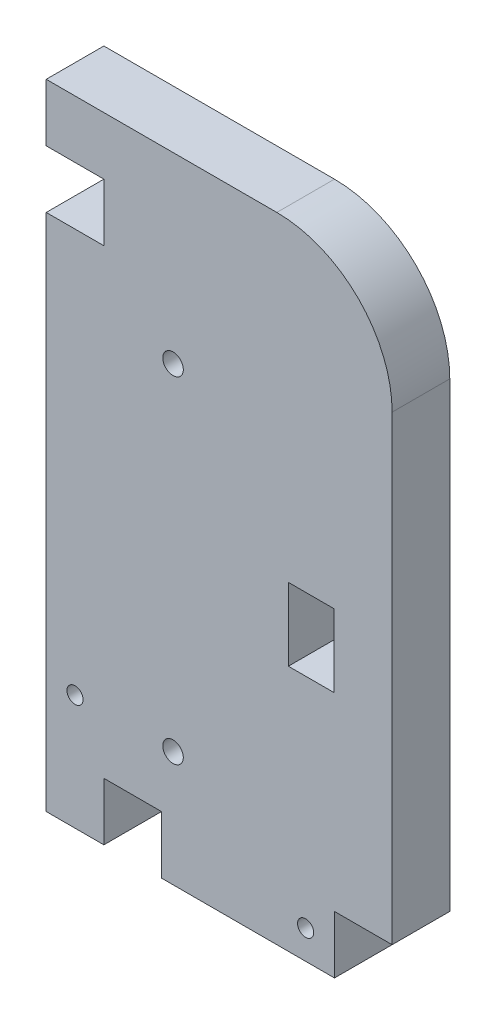
ISO-10303-21;
HEADER;
FILE_DESCRIPTION(('STEP AP214'),'2;1');
FILE_NAME('part.step','',(''),(''),'','','');
FILE_SCHEMA(('AUTOMOTIVE_DESIGN { 1 0 10303 214 1 1 1 1 }'));
ENDSEC;
DATA;
#1=APPLICATION_CONTEXT('core data for automotive mechanical design processes');
#2=APPLICATION_PROTOCOL_DEFINITION('international standard','automotive_design',2000,#1);
#3=PRODUCT_CONTEXT('',#1,'mechanical');
#4=PRODUCT('Part','Part','',(#3));
#5=PRODUCT_RELATED_PRODUCT_CATEGORY('part','',(#4));
#6=PRODUCT_DEFINITION_FORMATION('','',#4);
#7=PRODUCT_DEFINITION_CONTEXT('part definition',#1,'design');
#8=PRODUCT_DEFINITION('design','',#6,#7);
#9=PRODUCT_DEFINITION_SHAPE('','',#8);
#10=(LENGTH_UNIT() NAMED_UNIT(*) SI_UNIT(.MILLI.,.METRE.));
#11=(NAMED_UNIT(*) PLANE_ANGLE_UNIT() SI_UNIT($,.RADIAN.));
#12=(NAMED_UNIT(*) SI_UNIT($,.STERADIAN.) SOLID_ANGLE_UNIT());
#13=UNCERTAINTY_MEASURE_WITH_UNIT(LENGTH_MEASURE(1.E-05),#10,'distance_accuracy_value','');
#14=(GEOMETRIC_REPRESENTATION_CONTEXT(3) GLOBAL_UNCERTAINTY_ASSIGNED_CONTEXT((#13)) GLOBAL_UNIT_ASSIGNED_CONTEXT((#10,
#11,#12)) REPRESENTATION_CONTEXT('',''));
#15=CARTESIAN_POINT('',(0.,0.,0.));
#16=DIRECTION('',(0.,0.,1.));
#17=DIRECTION('',(1.,0.,0.));
#18=AXIS2_PLACEMENT_3D('',#15,#16,#17);
#19=CARTESIAN_POINT('',(9.26546463834282,9.31727084526302,6.35));
#20=DIRECTION('',(0.,0.,-1.));
#21=DIRECTION('',(-1.,0.,0.));
#22=AXIS2_PLACEMENT_3D('',#19,#20,#21);
#23=PLANE('',#22);
#24=CARTESIAN_POINT('',(12.4404646383428,-44.657729154737,6.35));
#25=DIRECTION('',(0.,0.,1.));
#26=DIRECTION('',(1.,0.,0.));
#27=AXIS2_PLACEMENT_3D('',#24,#25,#26);
#28=CIRCLE('',#27,0.888999999999999);
#29=CARTESIAN_POINT('',(13.3294646383428,-44.657729154737,6.35));
#30=VERTEX_POINT('',#29);
#31=EDGE_CURVE('E193',#30,#30,#28,.T.);
#32=ORIENTED_EDGE('',*,*,#31,.F.);
#33=EDGE_LOOP('',(#32));
#34=FACE_BOUND('',#33,.T.);
#35=CARTESIAN_POINT('',(-2.16453536165717,1.86727084526301,6.35));
#36=DIRECTION('',(0.,0.,1.));
#37=DIRECTION('',(1.,0.,0.));
#38=AXIS2_PLACEMENT_3D('',#35,#36,#37);
#39=CIRCLE('',#38,1.1303);
#40=CARTESIAN_POINT('',(-1.03423536165717,1.86727084526301,6.35));
#41=VERTEX_POINT('',#40);
#42=EDGE_CURVE('E203',#41,#41,#39,.T.);
#43=ORIENTED_EDGE('',*,*,#42,.F.);
#44=EDGE_LOOP('',(#43));
#45=FACE_BOUND('',#44,.T.);
#46=DIRECTION('',(0.,-1.,0.));
#47=VECTOR('',#46,1.);
#48=CARTESIAN_POINT('',(-16.1345353616572,22.017270845263,6.35));
#49=LINE('',#48,#47);
#50=CARTESIAN_POINT('',(-16.1345353616572,22.017270845263,6.35));
#51=VERTEX_POINT('',#50);
#52=CARTESIAN_POINT('',(-16.1345353616572,15.667270845263,6.35));
#53=VERTEX_POINT('',#52);
#54=EDGE_CURVE('E215',#51,#53,#49,.T.);
#55=ORIENTED_EDGE('',*,*,#54,.T.);
#56=DIRECTION('',(1.,0.,0.));
#57=VECTOR('',#56,1.);
#58=CARTESIAN_POINT('',(-16.1345353616572,15.667270845263,6.35));
#59=LINE('',#58,#57);
#60=CARTESIAN_POINT('',(-9.78453536165718,15.667270845263,6.35));
#61=VERTEX_POINT('',#60);
#62=EDGE_CURVE('E218',#53,#61,#59,.T.);
#63=ORIENTED_EDGE('',*,*,#62,.T.);
#64=DIRECTION('',(0.,-1.,0.));
#65=VECTOR('',#64,1.);
#66=CARTESIAN_POINT('',(-9.78453536165718,15.667270845263,6.35));
#67=LINE('',#66,#65);
#68=CARTESIAN_POINT('',(-9.78453536165718,9.31727084526301,6.35));
#69=VERTEX_POINT('',#68);
#70=EDGE_CURVE('E221',#61,#69,#67,.T.);
#71=ORIENTED_EDGE('',*,*,#70,.T.);
#72=DIRECTION('',(-1.,0.,0.));
#73=VECTOR('',#72,1.);
#74=CARTESIAN_POINT('',(-16.1345353616572,9.31727084526301,6.35));
#75=LINE('',#74,#73);
#76=CARTESIAN_POINT('',(-16.1345353616572,9.31727084526301,6.35));
#77=VERTEX_POINT('',#76);
#78=EDGE_CURVE('E223',#69,#77,#75,.T.);
#79=ORIENTED_EDGE('',*,*,#78,.T.);
#80=DIRECTION('',(0.,-1.,0.));
#81=VECTOR('',#80,1.);
#82=CARTESIAN_POINT('',(-16.1345353616572,9.31727084526301,6.35));
#83=LINE('',#82,#81);
#84=CARTESIAN_POINT('',(-16.1345353616572,-47.832729154737,6.35));
#85=VERTEX_POINT('',#84);
#86=EDGE_CURVE('E225',#77,#85,#83,.T.);
#87=ORIENTED_EDGE('',*,*,#86,.T.);
#88=DIRECTION('',(1.,0.,0.));
#89=VECTOR('',#88,1.);
#90=CARTESIAN_POINT('',(-16.1345353616572,-47.832729154737,6.35));
#91=LINE('',#90,#89);
#92=CARTESIAN_POINT('',(-9.78453536165718,-47.832729154737,6.35));
#93=VERTEX_POINT('',#92);
#94=EDGE_CURVE('E227',#85,#93,#91,.T.);
#95=ORIENTED_EDGE('',*,*,#94,.T.);
#96=DIRECTION('',(0.,1.,0.));
#97=VECTOR('',#96,1.);
#98=CARTESIAN_POINT('',(-9.78453536165718,-47.832729154737,6.35));
#99=LINE('',#98,#97);
#100=CARTESIAN_POINT('',(-9.78453536165719,-41.482729154737,6.35));
#101=VERTEX_POINT('',#100);
#102=EDGE_CURVE('E229',#93,#101,#99,.T.);
#103=ORIENTED_EDGE('',*,*,#102,.T.);
#104=DIRECTION('',(1.,0.,0.));
#105=VECTOR('',#104,1.);
#106=CARTESIAN_POINT('',(-9.78453536165719,-41.482729154737,6.35));
#107=LINE('',#106,#105);
#108=CARTESIAN_POINT('',(-3.43453536165719,-41.482729154737,6.35));
#109=VERTEX_POINT('',#108);
#110=EDGE_CURVE('E231',#101,#109,#107,.T.);
#111=ORIENTED_EDGE('',*,*,#110,.T.);
#112=DIRECTION('',(0.,-1.,0.));
#113=VECTOR('',#112,1.);
#114=CARTESIAN_POINT('',(-3.43453536165719,-47.832729154737,6.35));
#115=LINE('',#114,#113);
#116=CARTESIAN_POINT('',(-3.43453536165719,-47.832729154737,6.35));
#117=VERTEX_POINT('',#116);
#118=EDGE_CURVE('E233',#109,#117,#115,.T.);
#119=ORIENTED_EDGE('',*,*,#118,.T.);
#120=DIRECTION('',(1.,0.,0.));
#121=VECTOR('',#120,1.);
#122=CARTESIAN_POINT('',(-3.43453536165719,-47.832729154737,6.35));
#123=LINE('',#122,#121);
#124=CARTESIAN_POINT('',(15.6154646383428,-47.832729154737,6.35));
#125=VERTEX_POINT('',#124);
#126=EDGE_CURVE('E235',#117,#125,#123,.T.);
#127=ORIENTED_EDGE('',*,*,#126,.T.);
#128=DIRECTION('',(0.,1.,0.));
#129=VECTOR('',#128,1.);
#130=CARTESIAN_POINT('',(15.6154646383428,-47.832729154737,6.35));
#131=LINE('',#130,#129);
#132=CARTESIAN_POINT('',(15.6154646383428,-41.482729154737,6.35));
#133=VERTEX_POINT('',#132);
#134=EDGE_CURVE('E237',#125,#133,#131,.T.);
#135=ORIENTED_EDGE('',*,*,#134,.T.);
#136=DIRECTION('',(1.,0.,0.));
#137=VECTOR('',#136,1.);
#138=CARTESIAN_POINT('',(21.9654646383428,-41.482729154737,6.35));
#139=LINE('',#138,#137);
#140=CARTESIAN_POINT('',(21.9654646383428,-41.482729154737,6.35));
#141=VERTEX_POINT('',#140);
#142=EDGE_CURVE('E239',#133,#141,#139,.T.);
#143=ORIENTED_EDGE('',*,*,#142,.T.);
#144=DIRECTION('',(0.,1.,0.));
#145=VECTOR('',#144,1.);
#146=CARTESIAN_POINT('',(21.9654646383428,9.31727084526293,6.35));
#147=LINE('',#146,#145);
#148=CARTESIAN_POINT('',(21.9654646383428,9.31727084526294,6.35));
#149=VERTEX_POINT('',#148);
#150=EDGE_CURVE('E241',#141,#149,#147,.T.);
#151=ORIENTED_EDGE('',*,*,#150,.T.);
#152=CARTESIAN_POINT('',(9.26546463834282,9.31727084526302,6.35));
#153=DIRECTION('',(0.,0.,1.));
#154=DIRECTION('',(-1.,0.,0.));
#155=AXIS2_PLACEMENT_3D('',#152,#153,#154);
#156=CIRCLE('',#155,12.7);
#157=CARTESIAN_POINT('',(9.26546463834273,22.017270845263,6.35));
#158=VERTEX_POINT('',#157);
#159=EDGE_CURVE('E243',#149,#158,#156,.T.);
#160=ORIENTED_EDGE('',*,*,#159,.T.);
#161=DIRECTION('',(-1.,0.,0.));
#162=VECTOR('',#161,1.);
#163=CARTESIAN_POINT('',(-16.1345353616572,22.017270845263,6.35));
#164=LINE('',#163,#162);
#165=EDGE_CURVE('E245',#158,#51,#164,.T.);
#166=ORIENTED_EDGE('',*,*,#165,.T.);
#167=EDGE_LOOP('',(#55,#63,#71,#79,#87,#95,#103,#111,#119,#127,#135,#143,#151,#160,#166));
#168=FACE_BOUND('',#167,.T.);
#169=CARTESIAN_POINT('',(-2.16453536165716,-35.132729154737,6.35));
#170=DIRECTION('',(0.,0.,1.));
#171=DIRECTION('',(1.,0.,0.));
#172=AXIS2_PLACEMENT_3D('',#169,#170,#171);
#173=CIRCLE('',#172,1.1303);
#174=CARTESIAN_POINT('',(-1.03423536165716,-35.132729154737,6.35));
#175=VERTEX_POINT('',#174);
#176=EDGE_CURVE('E209',#175,#175,#173,.T.);
#177=ORIENTED_EDGE('',*,*,#176,.F.);
#178=EDGE_LOOP('',(#177));
#179=FACE_BOUND('',#178,.T.);
#180=DIRECTION('',(0.,-1.,0.));
#181=VECTOR('',#180,1.);
#182=CARTESIAN_POINT('',(10.5354646383428,-12.632729078737,6.35));
#183=LINE('',#182,#181);
#184=CARTESIAN_POINT('',(10.5354646383428,-12.632729078737,6.35));
#185=VERTEX_POINT('',#184);
#186=CARTESIAN_POINT('',(10.5354646383428,-20.632729080737,6.35));
#187=VERTEX_POINT('',#186);
#188=EDGE_CURVE('E164',#185,#187,#183,.T.);
#189=ORIENTED_EDGE('',*,*,#188,.F.);
#190=DIRECTION('',(-1.,0.,0.));
#191=VECTOR('',#190,1.);
#192=CARTESIAN_POINT('',(10.5354646383428,-12.632729078737,6.35));
#193=LINE('',#192,#191);
#194=CARTESIAN_POINT('',(15.5354646383428,-12.632729078737,6.35));
#195=VERTEX_POINT('',#194);
#196=EDGE_CURVE('E187',#195,#185,#193,.T.);
#197=ORIENTED_EDGE('',*,*,#196,.F.);
#198=DIRECTION('',(0.,1.,0.));
#199=VECTOR('',#198,1.);
#200=CARTESIAN_POINT('',(15.5354646383428,-12.632729078737,6.35));
#201=LINE('',#200,#199);
#202=CARTESIAN_POINT('',(15.5354646383428,-20.632729080737,6.35));
#203=VERTEX_POINT('',#202);
#204=EDGE_CURVE('E185',#203,#195,#201,.T.);
#205=ORIENTED_EDGE('',*,*,#204,.F.);
#206=DIRECTION('',(1.,0.,0.));
#207=VECTOR('',#206,1.);
#208=CARTESIAN_POINT('',(10.5354646383428,-20.632729080737,6.35));
#209=LINE('',#208,#207);
#210=EDGE_CURVE('E172',#187,#203,#209,.T.);
#211=ORIENTED_EDGE('',*,*,#210,.F.);
#212=EDGE_LOOP('',(#189,#197,#205,#211));
#213=FACE_BOUND('',#212,.T.);
#214=CARTESIAN_POINT('',(-12.9595353616572,-35.132729154737,6.35));
#215=DIRECTION('',(0.,0.,1.));
#216=DIRECTION('',(1.,0.,0.));
#217=AXIS2_PLACEMENT_3D('',#214,#215,#216);
#218=CIRCLE('',#217,0.888999999999999);
#219=CARTESIAN_POINT('',(-12.0705353616572,-35.132729154737,6.35));
#220=VERTEX_POINT('',#219);
#221=EDGE_CURVE('E608',#220,#220,#218,.T.);
#222=ORIENTED_EDGE('',*,*,#221,.F.);
#223=EDGE_LOOP('',(#222));
#224=FACE_BOUND('',#223,.T.);
#225=ADVANCED_FACE('F33',(#34,#45,#168,#179,#213,#224),#23,.F.);
#226=CARTESIAN_POINT('',(9.26546463834282,9.31727084526302,0.));
#227=DIRECTION('',(0.,0.,-1.));
#228=DIRECTION('',(-1.,0.,0.));
#229=AXIS2_PLACEMENT_3D('',#226,#227,#228);
#230=PLANE('',#229);
#231=CARTESIAN_POINT('',(12.4404646383428,-44.657729154737,0.));
#232=DIRECTION('',(0.,0.,1.));
#233=DIRECTION('',(1.,0.,0.));
#234=AXIS2_PLACEMENT_3D('',#231,#232,#233);
#235=CIRCLE('',#234,0.888999999999999);
#236=CARTESIAN_POINT('',(13.3294646383428,-44.657729154737,0.));
#237=VERTEX_POINT('',#236);
#238=EDGE_CURVE('E614',#237,#237,#235,.T.);
#239=ORIENTED_EDGE('',*,*,#238,.T.);
#240=EDGE_LOOP('',(#239));
#241=FACE_BOUND('',#240,.T.);
#242=CARTESIAN_POINT('',(-2.16453536165717,1.86727084526301,0.));
#243=DIRECTION('',(0.,0.,1.));
#244=DIRECTION('',(1.,0.,0.));
#245=AXIS2_PLACEMENT_3D('',#242,#243,#244);
#246=CIRCLE('',#245,1.1303);
#247=CARTESIAN_POINT('',(-1.03423536165717,1.86727084526301,0.));
#248=VERTEX_POINT('',#247);
#249=EDGE_CURVE('E180',#248,#248,#246,.T.);
#250=ORIENTED_EDGE('',*,*,#249,.T.);
#251=EDGE_LOOP('',(#250));
#252=FACE_BOUND('',#251,.T.);
#253=DIRECTION('',(0.,-1.,0.));
#254=VECTOR('',#253,1.);
#255=CARTESIAN_POINT('',(-16.1345353616572,22.017270845263,0.));
#256=LINE('',#255,#254);
#257=CARTESIAN_POINT('',(-16.1345353616572,22.017270845263,0.));
#258=VERTEX_POINT('',#257);
#259=CARTESIAN_POINT('',(-16.1345353616572,15.667270845263,0.));
#260=VERTEX_POINT('',#259);
#261=EDGE_CURVE('E212',#258,#260,#256,.T.);
#262=ORIENTED_EDGE('',*,*,#261,.F.);
#263=DIRECTION('',(-1.,0.,0.));
#264=VECTOR('',#263,1.);
#265=CARTESIAN_POINT('',(-16.1345353616572,22.017270845263,0.));
#266=LINE('',#265,#264);
#267=CARTESIAN_POINT('',(9.26546463834273,22.017270845263,0.));
#268=VERTEX_POINT('',#267);
#269=EDGE_CURVE('E219',#268,#258,#266,.T.);
#270=ORIENTED_EDGE('',*,*,#269,.F.);
#271=CARTESIAN_POINT('',(9.26546463834282,9.31727084526302,0.));
#272=DIRECTION('',(0.,0.,1.));
#273=DIRECTION('',(-1.,0.,0.));
#274=AXIS2_PLACEMENT_3D('',#271,#272,#273);
#275=CIRCLE('',#274,12.7);
#276=CARTESIAN_POINT('',(21.9654646383428,9.31727084526294,0.));
#277=VERTEX_POINT('',#276);
#278=EDGE_CURVE('E274',#277,#268,#275,.T.);
#279=ORIENTED_EDGE('',*,*,#278,.F.);
#280=DIRECTION('',(0.,1.,0.));
#281=VECTOR('',#280,1.);
#282=CARTESIAN_POINT('',(21.9654646383428,9.31727084526293,0.));
#283=LINE('',#282,#281);
#284=CARTESIAN_POINT('',(21.9654646383428,-41.482729154737,0.));
#285=VERTEX_POINT('',#284);
#286=EDGE_CURVE('E272',#285,#277,#283,.T.);
#287=ORIENTED_EDGE('',*,*,#286,.F.);
#288=DIRECTION('',(1.,0.,0.));
#289=VECTOR('',#288,1.);
#290=CARTESIAN_POINT('',(21.9654646383428,-41.482729154737,0.));
#291=LINE('',#290,#289);
#292=CARTESIAN_POINT('',(15.6154646383428,-41.482729154737,0.));
#293=VERTEX_POINT('',#292);
#294=EDGE_CURVE('E270',#293,#285,#291,.T.);
#295=ORIENTED_EDGE('',*,*,#294,.F.);
#296=DIRECTION('',(0.,1.,0.));
#297=VECTOR('',#296,1.);
#298=CARTESIAN_POINT('',(15.6154646383428,-47.832729154737,0.));
#299=LINE('',#298,#297);
#300=CARTESIAN_POINT('',(15.6154646383428,-47.832729154737,0.));
#301=VERTEX_POINT('',#300);
#302=EDGE_CURVE('E268',#301,#293,#299,.T.);
#303=ORIENTED_EDGE('',*,*,#302,.F.);
#304=DIRECTION('',(1.,0.,0.));
#305=VECTOR('',#304,1.);
#306=CARTESIAN_POINT('',(-3.43453536165719,-47.832729154737,0.));
#307=LINE('',#306,#305);
#308=CARTESIAN_POINT('',(-3.43453536165719,-47.832729154737,0.));
#309=VERTEX_POINT('',#308);
#310=EDGE_CURVE('E266',#309,#301,#307,.T.);
#311=ORIENTED_EDGE('',*,*,#310,.F.);
#312=DIRECTION('',(0.,-1.,0.));
#313=VECTOR('',#312,1.);
#314=CARTESIAN_POINT('',(-3.43453536165719,-47.832729154737,0.));
#315=LINE('',#314,#313);
#316=CARTESIAN_POINT('',(-3.43453536165719,-41.482729154737,0.));
#317=VERTEX_POINT('',#316);
#318=EDGE_CURVE('E264',#317,#309,#315,.T.);
#319=ORIENTED_EDGE('',*,*,#318,.F.);
#320=DIRECTION('',(1.,0.,0.));
#321=VECTOR('',#320,1.);
#322=CARTESIAN_POINT('',(-9.78453536165719,-41.482729154737,0.));
#323=LINE('',#322,#321);
#324=CARTESIAN_POINT('',(-9.78453536165719,-41.482729154737,0.));
#325=VERTEX_POINT('',#324);
#326=EDGE_CURVE('E262',#325,#317,#323,.T.);
#327=ORIENTED_EDGE('',*,*,#326,.F.);
#328=DIRECTION('',(0.,1.,0.));
#329=VECTOR('',#328,1.);
#330=CARTESIAN_POINT('',(-9.78453536165718,-47.832729154737,0.));
#331=LINE('',#330,#329);
#332=CARTESIAN_POINT('',(-9.78453536165718,-47.832729154737,0.));
#333=VERTEX_POINT('',#332);
#334=EDGE_CURVE('E260',#333,#325,#331,.T.);
#335=ORIENTED_EDGE('',*,*,#334,.F.);
#336=DIRECTION('',(1.,0.,0.));
#337=VECTOR('',#336,1.);
#338=CARTESIAN_POINT('',(-16.1345353616572,-47.832729154737,0.));
#339=LINE('',#338,#337);
#340=CARTESIAN_POINT('',(-16.1345353616572,-47.832729154737,0.));
#341=VERTEX_POINT('',#340);
#342=EDGE_CURVE('E258',#341,#333,#339,.T.);
#343=ORIENTED_EDGE('',*,*,#342,.F.);
#344=DIRECTION('',(0.,-1.,0.));
#345=VECTOR('',#344,1.);
#346=CARTESIAN_POINT('',(-16.1345353616572,9.31727084526301,0.));
#347=LINE('',#346,#345);
#348=CARTESIAN_POINT('',(-16.1345353616572,9.31727084526301,0.));
#349=VERTEX_POINT('',#348);
#350=EDGE_CURVE('E256',#349,#341,#347,.T.);
#351=ORIENTED_EDGE('',*,*,#350,.F.);
#352=DIRECTION('',(-1.,0.,0.));
#353=VECTOR('',#352,1.);
#354=CARTESIAN_POINT('',(-16.1345353616572,9.31727084526301,0.));
#355=LINE('',#354,#353);
#356=CARTESIAN_POINT('',(-9.78453536165718,9.31727084526301,0.));
#357=VERTEX_POINT('',#356);
#358=EDGE_CURVE('E254',#357,#349,#355,.T.);
#359=ORIENTED_EDGE('',*,*,#358,.F.);
#360=DIRECTION('',(0.,-1.,0.));
#361=VECTOR('',#360,1.);
#362=CARTESIAN_POINT('',(-9.78453536165718,15.667270845263,0.));
#363=LINE('',#362,#361);
#364=CARTESIAN_POINT('',(-9.78453536165718,15.667270845263,0.));
#365=VERTEX_POINT('',#364);
#366=EDGE_CURVE('E252',#365,#357,#363,.T.);
#367=ORIENTED_EDGE('',*,*,#366,.F.);
#368=DIRECTION('',(1.,0.,0.));
#369=VECTOR('',#368,1.);
#370=CARTESIAN_POINT('',(-16.1345353616572,15.667270845263,0.));
#371=LINE('',#370,#369);
#372=EDGE_CURVE('E250',#260,#365,#371,.T.);
#373=ORIENTED_EDGE('',*,*,#372,.F.);
#374=EDGE_LOOP('',(#262,#270,#279,#287,#295,#303,#311,#319,#327,#335,#343,#351,#359,#367,#373));
#375=FACE_BOUND('',#374,.T.);
#376=CARTESIAN_POINT('',(-2.16453536165716,-35.132729154737,0.));
#377=DIRECTION('',(0.,0.,1.));
#378=DIRECTION('',(1.,0.,0.));
#379=AXIS2_PLACEMENT_3D('',#376,#377,#378);
#380=CIRCLE('',#379,1.1303);
#381=CARTESIAN_POINT('',(-1.03423536165716,-35.132729154737,0.));
#382=VERTEX_POINT('',#381);
#383=EDGE_CURVE('E206',#382,#382,#380,.T.);
#384=ORIENTED_EDGE('',*,*,#383,.T.);
#385=EDGE_LOOP('',(#384));
#386=FACE_BOUND('',#385,.T.);
#387=DIRECTION('',(-1.,0.,0.));
#388=VECTOR('',#387,1.);
#389=CARTESIAN_POINT('',(10.5354646383428,-12.632729078737,0.));
#390=LINE('',#389,#388);
#391=CARTESIAN_POINT('',(15.5354646383428,-12.632729078737,0.));
#392=VERTEX_POINT('',#391);
#393=CARTESIAN_POINT('',(10.5354646383428,-12.632729078737,0.));
#394=VERTEX_POINT('',#393);
#395=EDGE_CURVE('E173',#392,#394,#390,.T.);
#396=ORIENTED_EDGE('',*,*,#395,.T.);
#397=DIRECTION('',(0.,-1.,0.));
#398=VECTOR('',#397,1.);
#399=CARTESIAN_POINT('',(10.5354646383428,-12.632729078737,0.));
#400=LINE('',#399,#398);
#401=CARTESIAN_POINT('',(10.5354646383428,-20.632729080737,0.));
#402=VERTEX_POINT('',#401);
#403=EDGE_CURVE('E56',#394,#402,#400,.T.);
#404=ORIENTED_EDGE('',*,*,#403,.T.);
#405=DIRECTION('',(1.,0.,0.));
#406=VECTOR('',#405,1.);
#407=CARTESIAN_POINT('',(10.5354646383428,-20.632729080737,0.));
#408=LINE('',#407,#406);
#409=CARTESIAN_POINT('',(15.5354646383428,-20.632729080737,0.));
#410=VERTEX_POINT('',#409);
#411=EDGE_CURVE('E179',#402,#410,#408,.T.);
#412=ORIENTED_EDGE('',*,*,#411,.T.);
#413=DIRECTION('',(0.,1.,0.));
#414=VECTOR('',#413,1.);
#415=CARTESIAN_POINT('',(15.5354646383428,-12.632729078737,0.));
#416=LINE('',#415,#414);
#417=EDGE_CURVE('E195',#410,#392,#416,.T.);
#418=ORIENTED_EDGE('',*,*,#417,.T.);
#419=EDGE_LOOP('',(#396,#404,#412,#418));
#420=FACE_BOUND('',#419,.T.);
#421=CARTESIAN_POINT('',(-12.9595353616572,-35.132729154737,0.));
#422=DIRECTION('',(0.,0.,1.));
#423=DIRECTION('',(1.,0.,0.));
#424=AXIS2_PLACEMENT_3D('',#421,#422,#423);
#425=CIRCLE('',#424,0.888999999999999);
#426=CARTESIAN_POINT('',(-12.0705353616572,-35.132729154737,0.));
#427=VERTEX_POINT('',#426);
#428=EDGE_CURVE('E611',#427,#427,#425,.T.);
#429=ORIENTED_EDGE('',*,*,#428,.T.);
#430=EDGE_LOOP('',(#429));
#431=FACE_BOUND('',#430,.T.);
#432=ADVANCED_FACE('F325',(#241,#252,#375,#386,#420,#431),#230,.T.);
#433=CARTESIAN_POINT('',(-16.1345353616572,22.017270845263,6.35));
#434=DIRECTION('',(1.,0.,0.));
#435=DIRECTION('',(0.,1.,0.));
#436=AXIS2_PLACEMENT_3D('',#433,#434,#435);
#437=PLANE('',#436);
#438=ORIENTED_EDGE('',*,*,#261,.T.);
#439=DIRECTION('',(0.,0.,-1.));
#440=VECTOR('',#439,1.);
#441=CARTESIAN_POINT('',(-16.1345353616572,15.667270845263,6.35));
#442=LINE('',#441,#440);
#443=EDGE_CURVE('E11',#53,#260,#442,.T.);
#444=ORIENTED_EDGE('',*,*,#443,.F.);
#445=ORIENTED_EDGE('',*,*,#54,.F.);
#446=DIRECTION('',(0.,0.,-1.));
#447=VECTOR('',#446,1.);
#448=CARTESIAN_POINT('',(-16.1345353616572,22.017270845263,6.35));
#449=LINE('',#448,#447);
#450=EDGE_CURVE('E247',#51,#258,#449,.T.);
#451=ORIENTED_EDGE('',*,*,#450,.T.);
#452=EDGE_LOOP('',(#438,#444,#445,#451));
#453=FACE_BOUND('',#452,.T.);
#454=ADVANCED_FACE('F35',(#453),#437,.F.);
#455=CARTESIAN_POINT('',(-16.1345353616572,15.667270845263,6.35));
#456=DIRECTION('',(0.,1.,0.));
#457=DIRECTION('',(0.,0.,1.));
#458=AXIS2_PLACEMENT_3D('',#455,#456,#457);
#459=PLANE('',#458);
#460=ORIENTED_EDGE('',*,*,#372,.T.);
#461=DIRECTION('',(0.,0.,-1.));
#462=VECTOR('',#461,1.);
#463=CARTESIAN_POINT('',(-9.78453536165718,15.667270845263,6.35));
#464=LINE('',#463,#462);
#465=EDGE_CURVE('E41',#61,#365,#464,.T.);
#466=ORIENTED_EDGE('',*,*,#465,.F.);
#467=ORIENTED_EDGE('',*,*,#62,.F.);
#468=ORIENTED_EDGE('',*,*,#443,.T.);
#469=EDGE_LOOP('',(#460,#466,#467,#468));
#470=FACE_BOUND('',#469,.T.);
#471=ADVANCED_FACE('F343',(#470),#459,.F.);
#472=CARTESIAN_POINT('',(-9.78453536165718,15.667270845263,6.35));
#473=DIRECTION('',(1.,0.,0.));
#474=DIRECTION('',(0.,0.,-1.));
#475=AXIS2_PLACEMENT_3D('',#472,#473,#474);
#476=PLANE('',#475);
#477=ORIENTED_EDGE('',*,*,#366,.T.);
#478=DIRECTION('',(0.,0.,-1.));
#479=VECTOR('',#478,1.);
#480=CARTESIAN_POINT('',(-9.78453536165718,9.31727084526301,6.35));
#481=LINE('',#480,#479);
#482=EDGE_CURVE('E312',#69,#357,#481,.T.);
#483=ORIENTED_EDGE('',*,*,#482,.F.);
#484=ORIENTED_EDGE('',*,*,#70,.F.);
#485=ORIENTED_EDGE('',*,*,#465,.T.);
#486=EDGE_LOOP('',(#477,#483,#484,#485));
#487=FACE_BOUND('',#486,.T.);
#488=ADVANCED_FACE('F319',(#487),#476,.F.);
#489=CARTESIAN_POINT('',(-16.1345353616572,9.31727084526301,6.35));
#490=DIRECTION('',(0.,-1.,0.));
#491=DIRECTION('',(0.,0.,-1.));
#492=AXIS2_PLACEMENT_3D('',#489,#490,#491);
#493=PLANE('',#492);
#494=ORIENTED_EDGE('',*,*,#358,.T.);
#495=DIRECTION('',(0.,0.,-1.));
#496=VECTOR('',#495,1.);
#497=CARTESIAN_POINT('',(-16.1345353616572,9.31727084526301,6.35));
#498=LINE('',#497,#496);
#499=EDGE_CURVE('E309',#77,#349,#498,.T.);
#500=ORIENTED_EDGE('',*,*,#499,.F.);
#501=ORIENTED_EDGE('',*,*,#78,.F.);
#502=ORIENTED_EDGE('',*,*,#482,.T.);
#503=EDGE_LOOP('',(#494,#500,#501,#502));
#504=FACE_BOUND('',#503,.T.);
#505=ADVANCED_FACE('F331',(#504),#493,.F.);
#506=CARTESIAN_POINT('',(-16.1345353616572,9.31727084526301,6.35));
#507=DIRECTION('',(1.,0.,0.));
#508=DIRECTION('',(0.,1.,0.));
#509=AXIS2_PLACEMENT_3D('',#506,#507,#508);
#510=PLANE('',#509);
#511=ORIENTED_EDGE('',*,*,#350,.T.);
#512=DIRECTION('',(0.,0.,-1.));
#513=VECTOR('',#512,1.);
#514=CARTESIAN_POINT('',(-16.1345353616572,-47.832729154737,6.35));
#515=LINE('',#514,#513);
#516=EDGE_CURVE('E306',#85,#341,#515,.T.);
#517=ORIENTED_EDGE('',*,*,#516,.F.);
#518=ORIENTED_EDGE('',*,*,#86,.F.);
#519=ORIENTED_EDGE('',*,*,#499,.T.);
#520=EDGE_LOOP('',(#511,#517,#518,#519));
#521=FACE_BOUND('',#520,.T.);
#522=ADVANCED_FACE('F335',(#521),#510,.F.);
#523=CARTESIAN_POINT('',(-16.1345353616572,-47.832729154737,6.35));
#524=DIRECTION('',(0.,1.,0.));
#525=DIRECTION('',(0.,0.,1.));
#526=AXIS2_PLACEMENT_3D('',#523,#524,#525);
#527=PLANE('',#526);
#528=ORIENTED_EDGE('',*,*,#342,.T.);
#529=DIRECTION('',(0.,0.,-1.));
#530=VECTOR('',#529,1.);
#531=CARTESIAN_POINT('',(-9.78453536165718,-47.832729154737,6.35));
#532=LINE('',#531,#530);
#533=EDGE_CURVE('E303',#93,#333,#532,.T.);
#534=ORIENTED_EDGE('',*,*,#533,.F.);
#535=ORIENTED_EDGE('',*,*,#94,.F.);
#536=ORIENTED_EDGE('',*,*,#516,.T.);
#537=EDGE_LOOP('',(#528,#534,#535,#536));
#538=FACE_BOUND('',#537,.T.);
#539=ADVANCED_FACE('F391',(#538),#527,.F.);
#540=CARTESIAN_POINT('',(-9.78453536165718,-47.832729154737,6.35));
#541=DIRECTION('',(-1.,0.,0.));
#542=DIRECTION('',(0.,-1.,0.));
#543=AXIS2_PLACEMENT_3D('',#540,#541,#542);
#544=PLANE('',#543);
#545=ORIENTED_EDGE('',*,*,#334,.T.);
#546=DIRECTION('',(0.,0.,-1.));
#547=VECTOR('',#546,1.);
#548=CARTESIAN_POINT('',(-9.78453536165719,-41.482729154737,6.35));
#549=LINE('',#548,#547);
#550=EDGE_CURVE('E300',#101,#325,#549,.T.);
#551=ORIENTED_EDGE('',*,*,#550,.F.);
#552=ORIENTED_EDGE('',*,*,#102,.F.);
#553=ORIENTED_EDGE('',*,*,#533,.T.);
#554=EDGE_LOOP('',(#545,#551,#552,#553));
#555=FACE_BOUND('',#554,.T.);
#556=ADVANCED_FACE('F389',(#555),#544,.F.);
#557=CARTESIAN_POINT('',(-9.78453536165719,-41.482729154737,6.35));
#558=DIRECTION('',(0.,1.,0.));
#559=DIRECTION('',(0.,0.,1.));
#560=AXIS2_PLACEMENT_3D('',#557,#558,#559);
#561=PLANE('',#560);
#562=ORIENTED_EDGE('',*,*,#326,.T.);
#563=DIRECTION('',(0.,0.,-1.));
#564=VECTOR('',#563,1.);
#565=CARTESIAN_POINT('',(-3.43453536165719,-41.482729154737,6.35));
#566=LINE('',#565,#564);
#567=EDGE_CURVE('E297',#109,#317,#566,.T.);
#568=ORIENTED_EDGE('',*,*,#567,.F.);
#569=ORIENTED_EDGE('',*,*,#110,.F.);
#570=ORIENTED_EDGE('',*,*,#550,.T.);
#571=EDGE_LOOP('',(#562,#568,#569,#570));
#572=FACE_BOUND('',#571,.T.);
#573=ADVANCED_FACE('F385',(#572),#561,.F.);
#574=CARTESIAN_POINT('',(-3.43453536165719,-47.832729154737,6.35));
#575=DIRECTION('',(1.,0.,0.));
#576=DIRECTION('',(0.,0.,-1.));
#577=AXIS2_PLACEMENT_3D('',#574,#575,#576);
#578=PLANE('',#577);
#579=ORIENTED_EDGE('',*,*,#318,.T.);
#580=DIRECTION('',(0.,0.,-1.));
#581=VECTOR('',#580,1.);
#582=CARTESIAN_POINT('',(-3.43453536165719,-47.832729154737,6.35));
#583=LINE('',#582,#581);
#584=EDGE_CURVE('E294',#117,#309,#583,.T.);
#585=ORIENTED_EDGE('',*,*,#584,.F.);
#586=ORIENTED_EDGE('',*,*,#118,.F.);
#587=ORIENTED_EDGE('',*,*,#567,.T.);
#588=EDGE_LOOP('',(#579,#585,#586,#587));
#589=FACE_BOUND('',#588,.T.);
#590=ADVANCED_FACE('F380',(#589),#578,.F.);
#591=CARTESIAN_POINT('',(-3.43453536165719,-47.832729154737,6.35));
#592=DIRECTION('',(0.,1.,0.));
#593=DIRECTION('',(-1.,0.,0.));
#594=AXIS2_PLACEMENT_3D('',#591,#592,#593);
#595=PLANE('',#594);
#596=ORIENTED_EDGE('',*,*,#310,.T.);
#597=DIRECTION('',(0.,0.,-1.));
#598=VECTOR('',#597,1.);
#599=CARTESIAN_POINT('',(15.6154646383428,-47.832729154737,6.35));
#600=LINE('',#599,#598);
#601=EDGE_CURVE('E291',#125,#301,#600,.T.);
#602=ORIENTED_EDGE('',*,*,#601,.F.);
#603=ORIENTED_EDGE('',*,*,#126,.F.);
#604=ORIENTED_EDGE('',*,*,#584,.T.);
#605=EDGE_LOOP('',(#596,#602,#603,#604));
#606=FACE_BOUND('',#605,.T.);
#607=ADVANCED_FACE('F374',(#606),#595,.F.);
#608=CARTESIAN_POINT('',(15.6154646383428,-47.832729154737,6.35));
#609=DIRECTION('',(-1.,0.,0.));
#610=DIRECTION('',(0.,-1.,0.));
#611=AXIS2_PLACEMENT_3D('',#608,#609,#610);
#612=PLANE('',#611);
#613=ORIENTED_EDGE('',*,*,#302,.T.);
#614=DIRECTION('',(0.,0.,-1.));
#615=VECTOR('',#614,1.);
#616=CARTESIAN_POINT('',(15.6154646383428,-41.482729154737,6.35));
#617=LINE('',#616,#615);
#618=EDGE_CURVE('E288',#133,#293,#617,.T.);
#619=ORIENTED_EDGE('',*,*,#618,.F.);
#620=ORIENTED_EDGE('',*,*,#134,.F.);
#621=ORIENTED_EDGE('',*,*,#601,.T.);
#622=EDGE_LOOP('',(#613,#619,#620,#621));
#623=FACE_BOUND('',#622,.T.);
#624=ADVANCED_FACE('F370',(#623),#612,.F.);
#625=CARTESIAN_POINT('',(21.9654646383428,-41.482729154737,6.35));
#626=DIRECTION('',(0.,1.,0.));
#627=DIRECTION('',(0.,0.,1.));
#628=AXIS2_PLACEMENT_3D('',#625,#626,#627);
#629=PLANE('',#628);
#630=ORIENTED_EDGE('',*,*,#294,.T.);
#631=DIRECTION('',(0.,0.,-1.));
#632=VECTOR('',#631,1.);
#633=CARTESIAN_POINT('',(21.9654646383428,-41.482729154737,6.35));
#634=LINE('',#633,#632);
#635=EDGE_CURVE('E285',#141,#285,#634,.T.);
#636=ORIENTED_EDGE('',*,*,#635,.F.);
#637=ORIENTED_EDGE('',*,*,#142,.F.);
#638=ORIENTED_EDGE('',*,*,#618,.T.);
#639=EDGE_LOOP('',(#630,#636,#637,#638));
#640=FACE_BOUND('',#639,.T.);
#641=ADVANCED_FACE('F365',(#640),#629,.F.);
#642=CARTESIAN_POINT('',(21.9654646383428,9.31727084526293,6.35));
#643=DIRECTION('',(-1.,0.,0.));
#644=DIRECTION('',(0.,-1.,0.));
#645=AXIS2_PLACEMENT_3D('',#642,#643,#644);
#646=PLANE('',#645);
#647=ORIENTED_EDGE('',*,*,#286,.T.);
#648=DIRECTION('',(0.,0.,-1.));
#649=VECTOR('',#648,1.);
#650=CARTESIAN_POINT('',(21.9654646383428,9.31727084526294,6.35));
#651=LINE('',#650,#649);
#652=EDGE_CURVE('E282',#149,#277,#651,.T.);
#653=ORIENTED_EDGE('',*,*,#652,.F.);
#654=ORIENTED_EDGE('',*,*,#150,.F.);
#655=ORIENTED_EDGE('',*,*,#635,.T.);
#656=EDGE_LOOP('',(#647,#653,#654,#655));
#657=FACE_BOUND('',#656,.T.);
#658=ADVANCED_FACE('F359',(#657),#646,.F.);
#659=CARTESIAN_POINT('',(9.26546463834282,9.31727084526302,6.35));
#660=DIRECTION('',(0.,0.,-1.));
#661=DIRECTION('',(-1.,0.,0.));
#662=AXIS2_PLACEMENT_3D('',#659,#660,#661);
#663=CYLINDRICAL_SURFACE('',#662,12.7);
#664=ORIENTED_EDGE('',*,*,#278,.T.);
#665=DIRECTION('',(0.,0.,-1.));
#666=VECTOR('',#665,1.);
#667=CARTESIAN_POINT('',(9.26546463834273,22.017270845263,6.35));
#668=LINE('',#667,#666);
#669=EDGE_CURVE('E279',#158,#268,#668,.T.);
#670=ORIENTED_EDGE('',*,*,#669,.F.);
#671=ORIENTED_EDGE('',*,*,#159,.F.);
#672=ORIENTED_EDGE('',*,*,#652,.T.);
#673=EDGE_LOOP('',(#664,#670,#671,#672));
#674=FACE_BOUND('',#673,.T.);
#675=ADVANCED_FACE('F355',(#674),#663,.T.);
#676=CARTESIAN_POINT('',(-16.1345353616572,22.017270845263,6.35));
#677=DIRECTION('',(0.,-1.,0.));
#678=DIRECTION('',(0.,0.,-1.));
#679=AXIS2_PLACEMENT_3D('',#676,#677,#678);
#680=PLANE('',#679);
#681=ORIENTED_EDGE('',*,*,#269,.T.);
#682=ORIENTED_EDGE('',*,*,#450,.F.);
#683=ORIENTED_EDGE('',*,*,#165,.F.);
#684=ORIENTED_EDGE('',*,*,#669,.T.);
#685=EDGE_LOOP('',(#681,#682,#683,#684));
#686=FACE_BOUND('',#685,.T.);
#687=ADVANCED_FACE('F350',(#686),#680,.F.);
#688=CARTESIAN_POINT('',(-2.16453536165716,-35.132729154737,6.35));
#689=DIRECTION('',(0.,0.,-1.));
#690=DIRECTION('',(-1.,0.,0.));
#691=AXIS2_PLACEMENT_3D('',#688,#689,#690);
#692=CYLINDRICAL_SURFACE('',#691,1.1303);
#693=ORIENTED_EDGE('',*,*,#176,.T.);
#694=EDGE_LOOP('',(#693));
#695=FACE_BOUND('',#694,.T.);
#696=ORIENTED_EDGE('',*,*,#383,.F.);
#697=EDGE_LOOP('',(#696));
#698=FACE_BOUND('',#697,.T.);
#699=ADVANCED_FACE('F411',(#695,#698),#692,.F.);
#700=CARTESIAN_POINT('',(-2.16453536165717,1.86727084526301,6.35));
#701=DIRECTION('',(0.,0.,-1.));
#702=DIRECTION('',(-1.,0.,0.));
#703=AXIS2_PLACEMENT_3D('',#700,#701,#702);
#704=CYLINDRICAL_SURFACE('',#703,1.1303);
#705=ORIENTED_EDGE('',*,*,#42,.T.);
#706=EDGE_LOOP('',(#705));
#707=FACE_BOUND('',#706,.T.);
#708=ORIENTED_EDGE('',*,*,#249,.F.);
#709=EDGE_LOOP('',(#708));
#710=FACE_BOUND('',#709,.T.);
#711=ADVANCED_FACE('F467',(#707,#710),#704,.F.);
#712=CARTESIAN_POINT('',(10.5354646383428,-12.632729078737,6.35));
#713=DIRECTION('',(1.,0.,0.));
#714=DIRECTION('',(0.,1.,0.));
#715=AXIS2_PLACEMENT_3D('',#712,#713,#714);
#716=PLANE('',#715);
#717=ORIENTED_EDGE('',*,*,#403,.F.);
#718=DIRECTION('',(0.,0.,-1.));
#719=VECTOR('',#718,1.);
#720=CARTESIAN_POINT('',(10.5354646383428,-12.632729078737,6.35));
#721=LINE('',#720,#719);
#722=EDGE_CURVE('E168',#185,#394,#721,.T.);
#723=ORIENTED_EDGE('',*,*,#722,.F.);
#724=ORIENTED_EDGE('',*,*,#188,.T.);
#725=DIRECTION('',(0.,0.,-1.));
#726=VECTOR('',#725,1.);
#727=CARTESIAN_POINT('',(10.5354646383428,-20.632729080737,6.35));
#728=LINE('',#727,#726);
#729=EDGE_CURVE('E167',#187,#402,#728,.T.);
#730=ORIENTED_EDGE('',*,*,#729,.T.);
#731=EDGE_LOOP('',(#717,#723,#724,#730));
#732=FACE_BOUND('',#731,.T.);
#733=ADVANCED_FACE('F166',(#732),#716,.T.);
#734=CARTESIAN_POINT('',(10.5354646383428,-20.632729080737,6.35));
#735=DIRECTION('',(0.,1.,0.));
#736=DIRECTION('',(0.,0.,1.));
#737=AXIS2_PLACEMENT_3D('',#734,#735,#736);
#738=PLANE('',#737);
#739=ORIENTED_EDGE('',*,*,#411,.F.);
#740=ORIENTED_EDGE('',*,*,#729,.F.);
#741=ORIENTED_EDGE('',*,*,#210,.T.);
#742=DIRECTION('',(0.,0.,-1.));
#743=VECTOR('',#742,1.);
#744=CARTESIAN_POINT('',(15.5354646383428,-20.632729080737,6.35));
#745=LINE('',#744,#743);
#746=EDGE_CURVE('E181',#203,#410,#745,.T.);
#747=ORIENTED_EDGE('',*,*,#746,.T.);
#748=EDGE_LOOP('',(#739,#740,#741,#747));
#749=FACE_BOUND('',#748,.T.);
#750=ADVANCED_FACE('F176',(#749),#738,.T.);
#751=CARTESIAN_POINT('',(15.5354646383428,-12.632729078737,6.35));
#752=DIRECTION('',(-1.,0.,0.));
#753=DIRECTION('',(0.,-1.,0.));
#754=AXIS2_PLACEMENT_3D('',#751,#752,#753);
#755=PLANE('',#754);
#756=ORIENTED_EDGE('',*,*,#417,.F.);
#757=ORIENTED_EDGE('',*,*,#746,.F.);
#758=ORIENTED_EDGE('',*,*,#204,.T.);
#759=DIRECTION('',(0.,0.,-1.));
#760=VECTOR('',#759,1.);
#761=CARTESIAN_POINT('',(15.5354646383428,-12.632729078737,6.35));
#762=LINE('',#761,#760);
#763=EDGE_CURVE('E48',#195,#392,#762,.T.);
#764=ORIENTED_EDGE('',*,*,#763,.T.);
#765=EDGE_LOOP('',(#756,#757,#758,#764));
#766=FACE_BOUND('',#765,.T.);
#767=ADVANCED_FACE('F486',(#766),#755,.T.);
#768=CARTESIAN_POINT('',(10.5354646383428,-12.632729078737,6.35));
#769=DIRECTION('',(0.,-1.,0.));
#770=DIRECTION('',(0.,0.,-1.));
#771=AXIS2_PLACEMENT_3D('',#768,#769,#770);
#772=PLANE('',#771);
#773=ORIENTED_EDGE('',*,*,#395,.F.);
#774=ORIENTED_EDGE('',*,*,#763,.F.);
#775=ORIENTED_EDGE('',*,*,#196,.T.);
#776=ORIENTED_EDGE('',*,*,#722,.T.);
#777=EDGE_LOOP('',(#773,#774,#775,#776));
#778=FACE_BOUND('',#777,.T.);
#779=ADVANCED_FACE('F493',(#778),#772,.T.);
#780=CARTESIAN_POINT('',(12.4404646383428,-44.657729154737,6.35));
#781=DIRECTION('',(0.,0.,-1.));
#782=DIRECTION('',(-1.,0.,0.));
#783=AXIS2_PLACEMENT_3D('',#780,#781,#782);
#784=CYLINDRICAL_SURFACE('',#783,0.888999999999999);
#785=ORIENTED_EDGE('',*,*,#31,.T.);
#786=EDGE_LOOP('',(#785));
#787=FACE_BOUND('',#786,.T.);
#788=ORIENTED_EDGE('',*,*,#238,.F.);
#789=EDGE_LOOP('',(#788));
#790=FACE_BOUND('',#789,.T.);
#791=ADVANCED_FACE('F501',(#787,#790),#784,.F.);
#792=CARTESIAN_POINT('',(-12.9595353616572,-35.132729154737,6.35));
#793=DIRECTION('',(0.,0.,-1.));
#794=DIRECTION('',(-1.,0.,0.));
#795=AXIS2_PLACEMENT_3D('',#792,#793,#794);
#796=CYLINDRICAL_SURFACE('',#795,0.888999999999999);
#797=ORIENTED_EDGE('',*,*,#221,.T.);
#798=EDGE_LOOP('',(#797));
#799=FACE_BOUND('',#798,.T.);
#800=ORIENTED_EDGE('',*,*,#428,.F.);
#801=EDGE_LOOP('',(#800));
#802=FACE_BOUND('',#801,.T.);
#803=ADVANCED_FACE('F508',(#799,#802),#796,.F.);
#804=CLOSED_SHELL('',(#225,#432,#454,#471,#488,#505,#522,#539,#556,#573,#590,#607,#624,#641,
#658,#675,#687,#699,#711,#733,#750,#767,#779,#791,#803));
#805=MANIFOLD_SOLID_BREP('B2',#804);
#806=ADVANCED_BREP_SHAPE_REPRESENTATION('',(#18,#805),#14);
#807=SHAPE_DEFINITION_REPRESENTATION(#9,#806);
ENDSEC;
END-ISO-10303-21;
